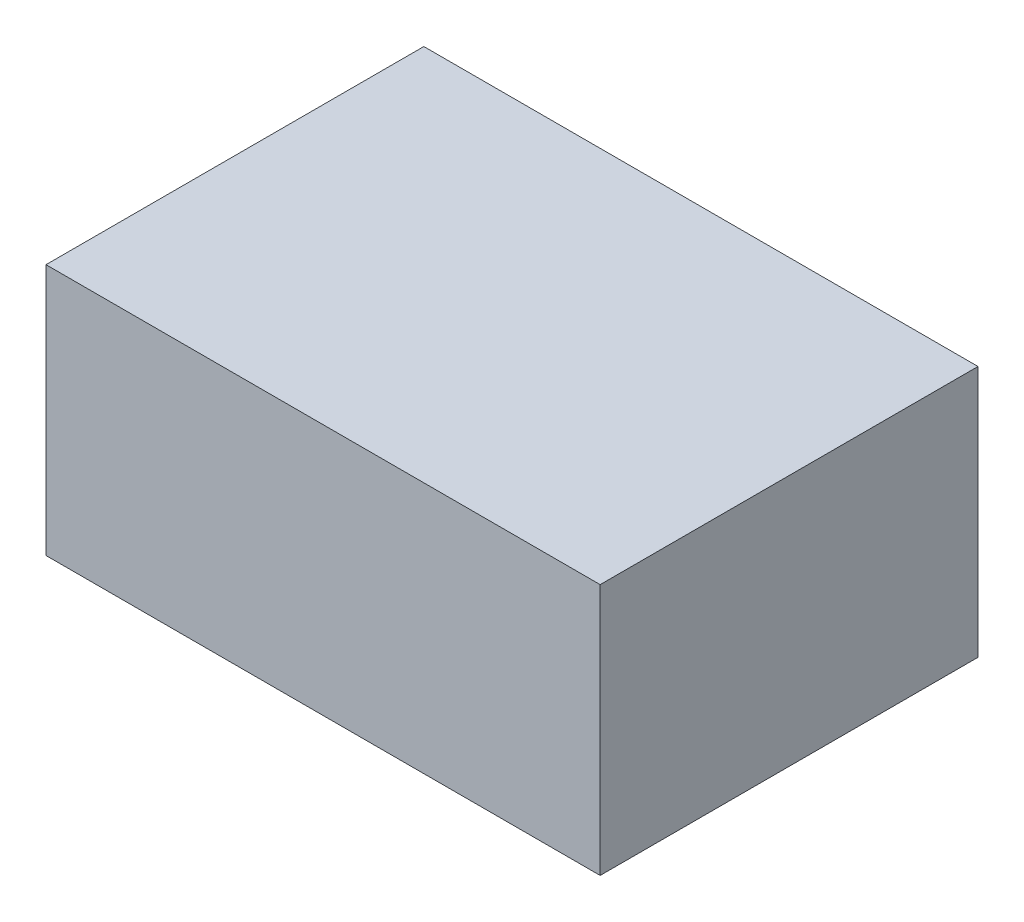
ISO-10303-21;
HEADER;
FILE_DESCRIPTION(('STEP AP214'),'2;1');
FILE_NAME('part.step','',(''),(''),'','','');
FILE_SCHEMA(('AUTOMOTIVE_DESIGN { 1 0 10303 214 1 1 1 1 }'));
ENDSEC;
DATA;
#1=APPLICATION_CONTEXT('core data for automotive mechanical design processes');
#2=APPLICATION_PROTOCOL_DEFINITION('international standard','automotive_design',2000,#1);
#3=PRODUCT_CONTEXT('',#1,'mechanical');
#4=PRODUCT('Part','Part','',(#3));
#5=PRODUCT_RELATED_PRODUCT_CATEGORY('part','',(#4));
#6=PRODUCT_DEFINITION_FORMATION('','',#4);
#7=PRODUCT_DEFINITION_CONTEXT('part definition',#1,'design');
#8=PRODUCT_DEFINITION('design','',#6,#7);
#9=PRODUCT_DEFINITION_SHAPE('','',#8);
#10=(LENGTH_UNIT() NAMED_UNIT(*) SI_UNIT(.MILLI.,.METRE.));
#11=(NAMED_UNIT(*) PLANE_ANGLE_UNIT() SI_UNIT($,.RADIAN.));
#12=(NAMED_UNIT(*) SI_UNIT($,.STERADIAN.) SOLID_ANGLE_UNIT());
#13=UNCERTAINTY_MEASURE_WITH_UNIT(LENGTH_MEASURE(1.E-05),#10,'distance_accuracy_value','');
#14=(GEOMETRIC_REPRESENTATION_CONTEXT(3) GLOBAL_UNCERTAINTY_ASSIGNED_CONTEXT((#13)) GLOBAL_UNIT_ASSIGNED_CONTEXT((#10,
#11,#12)) REPRESENTATION_CONTEXT('',''));
#15=CARTESIAN_POINT('',(0.,0.,0.));
#16=DIRECTION('',(0.,0.,1.));
#17=DIRECTION('',(1.,0.,0.));
#18=AXIS2_PLACEMENT_3D('',#15,#16,#17);
#19=CARTESIAN_POINT('',(-110.,100.,75.));
#20=DIRECTION('',(1.,0.,0.));
#21=DIRECTION('',(0.,0.,-1.));
#22=AXIS2_PLACEMENT_3D('',#19,#20,#21);
#23=PLANE('',#22);
#24=DIRECTION('',(0.,0.,1.));
#25=VECTOR('',#24,1.);
#26=CARTESIAN_POINT('',(-110.,0.,75.));
#27=LINE('',#26,#25);
#28=CARTESIAN_POINT('',(-110.,0.,-75.));
#29=VERTEX_POINT('',#28);
#30=CARTESIAN_POINT('',(-110.,0.,75.));
#31=VERTEX_POINT('',#30);
#32=EDGE_CURVE('E100',#29,#31,#27,.T.);
#33=ORIENTED_EDGE('',*,*,#32,.T.);
#34=DIRECTION('',(0.,-1.,0.));
#35=VECTOR('',#34,1.);
#36=CARTESIAN_POINT('',(-110.,100.,75.));
#37=LINE('',#36,#35);
#38=CARTESIAN_POINT('',(-110.,100.,75.));
#39=VERTEX_POINT('',#38);
#40=EDGE_CURVE('E11',#39,#31,#37,.T.);
#41=ORIENTED_EDGE('',*,*,#40,.F.);
#42=DIRECTION('',(0.,0.,1.));
#43=VECTOR('',#42,1.);
#44=CARTESIAN_POINT('',(-110.,100.,75.));
#45=LINE('',#44,#43);
#46=CARTESIAN_POINT('',(-110.,100.,-75.));
#47=VERTEX_POINT('',#46);
#48=EDGE_CURVE('E88',#47,#39,#45,.T.);
#49=ORIENTED_EDGE('',*,*,#48,.F.);
#50=DIRECTION('',(0.,-1.,0.));
#51=VECTOR('',#50,1.);
#52=CARTESIAN_POINT('',(-110.,100.,-75.));
#53=LINE('',#52,#51);
#54=EDGE_CURVE('E96',#47,#29,#53,.T.);
#55=ORIENTED_EDGE('',*,*,#54,.T.);
#56=EDGE_LOOP('',(#33,#41,#49,#55));
#57=FACE_BOUND('',#56,.T.);
#58=ADVANCED_FACE('F37',(#57),#23,.F.);
#59=CARTESIAN_POINT('',(110.,100.,75.));
#60=DIRECTION('',(0.,0.,-1.));
#61=DIRECTION('',(-1.,0.,0.));
#62=AXIS2_PLACEMENT_3D('',#59,#60,#61);
#63=PLANE('',#62);
#64=DIRECTION('',(1.,0.,0.));
#65=VECTOR('',#64,1.);
#66=CARTESIAN_POINT('',(110.,0.,75.));
#67=LINE('',#66,#65);
#68=CARTESIAN_POINT('',(110.,0.,75.));
#69=VERTEX_POINT('',#68);
#70=EDGE_CURVE('E92',#31,#69,#67,.T.);
#71=ORIENTED_EDGE('',*,*,#70,.T.);
#72=DIRECTION('',(0.,-1.,0.));
#73=VECTOR('',#72,1.);
#74=CARTESIAN_POINT('',(110.,100.,75.));
#75=LINE('',#74,#73);
#76=CARTESIAN_POINT('',(110.,100.,75.));
#77=VERTEX_POINT('',#76);
#78=EDGE_CURVE('E45',#77,#69,#75,.T.);
#79=ORIENTED_EDGE('',*,*,#78,.F.);
#80=DIRECTION('',(1.,0.,0.));
#81=VECTOR('',#80,1.);
#82=CARTESIAN_POINT('',(110.,100.,75.));
#83=LINE('',#82,#81);
#84=EDGE_CURVE('E83',#39,#77,#83,.T.);
#85=ORIENTED_EDGE('',*,*,#84,.F.);
#86=ORIENTED_EDGE('',*,*,#40,.T.);
#87=EDGE_LOOP('',(#71,#79,#85,#86));
#88=FACE_BOUND('',#87,.T.);
#89=ADVANCED_FACE('F91',(#88),#63,.F.);
#90=CARTESIAN_POINT('',(110.,100.,75.));
#91=DIRECTION('',(-1.,0.,0.));
#92=DIRECTION('',(0.,0.,1.));
#93=AXIS2_PLACEMENT_3D('',#90,#91,#92);
#94=PLANE('',#93);
#95=DIRECTION('',(0.,0.,-1.));
#96=VECTOR('',#95,1.);
#97=CARTESIAN_POINT('',(110.,0.,75.));
#98=LINE('',#97,#96);
#99=CARTESIAN_POINT('',(110.,0.,-75.));
#100=VERTEX_POINT('',#99);
#101=EDGE_CURVE('E70',#69,#100,#98,.T.);
#102=ORIENTED_EDGE('',*,*,#101,.T.);
#103=DIRECTION('',(0.,-1.,0.));
#104=VECTOR('',#103,1.);
#105=CARTESIAN_POINT('',(110.,100.,-75.));
#106=LINE('',#105,#104);
#107=CARTESIAN_POINT('',(110.,100.,-75.));
#108=VERTEX_POINT('',#107);
#109=EDGE_CURVE('E93',#108,#100,#106,.T.);
#110=ORIENTED_EDGE('',*,*,#109,.F.);
#111=DIRECTION('',(0.,0.,-1.));
#112=VECTOR('',#111,1.);
#113=CARTESIAN_POINT('',(110.,100.,75.));
#114=LINE('',#113,#112);
#115=EDGE_CURVE('E86',#77,#108,#114,.T.);
#116=ORIENTED_EDGE('',*,*,#115,.F.);
#117=ORIENTED_EDGE('',*,*,#78,.T.);
#118=EDGE_LOOP('',(#102,#110,#116,#117));
#119=FACE_BOUND('',#118,.T.);
#120=ADVANCED_FACE('F94',(#119),#94,.F.);
#121=CARTESIAN_POINT('',(110.,100.,-75.));
#122=DIRECTION('',(0.,0.,1.));
#123=DIRECTION('',(1.,0.,0.));
#124=AXIS2_PLACEMENT_3D('',#121,#122,#123);
#125=PLANE('',#124);
#126=DIRECTION('',(-1.,0.,0.));
#127=VECTOR('',#126,1.);
#128=CARTESIAN_POINT('',(110.,0.,-75.));
#129=LINE('',#128,#127);
#130=EDGE_CURVE('E76',#100,#29,#129,.T.);
#131=ORIENTED_EDGE('',*,*,#130,.T.);
#132=ORIENTED_EDGE('',*,*,#54,.F.);
#133=DIRECTION('',(-1.,0.,0.));
#134=VECTOR('',#133,1.);
#135=CARTESIAN_POINT('',(110.,100.,-75.));
#136=LINE('',#135,#134);
#137=EDGE_CURVE('E53',#108,#47,#136,.T.);
#138=ORIENTED_EDGE('',*,*,#137,.F.);
#139=ORIENTED_EDGE('',*,*,#109,.T.);
#140=EDGE_LOOP('',(#131,#132,#138,#139));
#141=FACE_BOUND('',#140,.T.);
#142=ADVANCED_FACE('F107',(#141),#125,.F.);
#143=CARTESIAN_POINT('',(0.,100.,0.));
#144=DIRECTION('',(0.,1.,0.));
#145=DIRECTION('',(0.,0.,1.));
#146=AXIS2_PLACEMENT_3D('',#143,#144,#145);
#147=PLANE('',#146);
#148=ORIENTED_EDGE('',*,*,#48,.T.);
#149=ORIENTED_EDGE('',*,*,#84,.T.);
#150=ORIENTED_EDGE('',*,*,#115,.T.);
#151=ORIENTED_EDGE('',*,*,#137,.T.);
#152=EDGE_LOOP('',(#148,#149,#150,#151));
#153=FACE_BOUND('',#152,.T.);
#154=ADVANCED_FACE('F84',(#153),#147,.T.);
#155=CARTESIAN_POINT('',(0.,0.,0.));
#156=DIRECTION('',(0.,1.,0.));
#157=DIRECTION('',(0.,0.,1.));
#158=AXIS2_PLACEMENT_3D('',#155,#156,#157);
#159=PLANE('',#158);
#160=ORIENTED_EDGE('',*,*,#32,.F.);
#161=ORIENTED_EDGE('',*,*,#130,.F.);
#162=ORIENTED_EDGE('',*,*,#101,.F.);
#163=ORIENTED_EDGE('',*,*,#70,.F.);
#164=EDGE_LOOP('',(#160,#161,#162,#163));
#165=FACE_BOUND('',#164,.T.);
#166=ADVANCED_FACE('F110',(#165),#159,.F.);
#167=CLOSED_SHELL('',(#58,#89,#120,#142,#154,#166));
#168=MANIFOLD_SOLID_BREP('B2',#167);
#169=ADVANCED_BREP_SHAPE_REPRESENTATION('',(#18,#168),#14);
#170=SHAPE_DEFINITION_REPRESENTATION(#9,#169);
ENDSEC;
END-ISO-10303-21;
